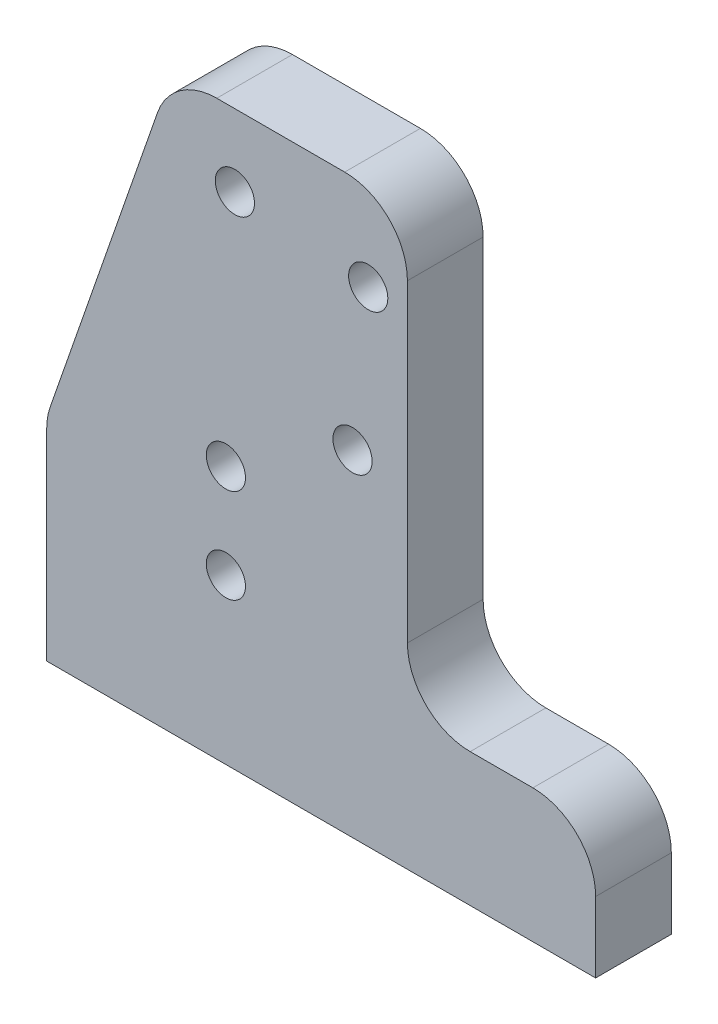
ISO-10303-21;
HEADER;
FILE_DESCRIPTION(('STEP AP214'),'2;1');
FILE_NAME('part.step','',(''),(''),'','','');
FILE_SCHEMA(('AUTOMOTIVE_DESIGN { 1 0 10303 214 1 1 1 1 }'));
ENDSEC;
DATA;
#1=APPLICATION_CONTEXT('core data for automotive mechanical design processes');
#2=APPLICATION_PROTOCOL_DEFINITION('international standard','automotive_design',2000,#1);
#3=PRODUCT_CONTEXT('',#1,'mechanical');
#4=PRODUCT('Part','Part','',(#3));
#5=PRODUCT_RELATED_PRODUCT_CATEGORY('part','',(#4));
#6=PRODUCT_DEFINITION_FORMATION('','',#4);
#7=PRODUCT_DEFINITION_CONTEXT('part definition',#1,'design');
#8=PRODUCT_DEFINITION('design','',#6,#7);
#9=PRODUCT_DEFINITION_SHAPE('','',#8);
#10=(LENGTH_UNIT() NAMED_UNIT(*) SI_UNIT(.MILLI.,.METRE.));
#11=(NAMED_UNIT(*) PLANE_ANGLE_UNIT() SI_UNIT($,.RADIAN.));
#12=(NAMED_UNIT(*) SI_UNIT($,.STERADIAN.) SOLID_ANGLE_UNIT());
#13=UNCERTAINTY_MEASURE_WITH_UNIT(LENGTH_MEASURE(1.E-05),#10,'distance_accuracy_value','');
#14=(GEOMETRIC_REPRESENTATION_CONTEXT(3) GLOBAL_UNCERTAINTY_ASSIGNED_CONTEXT((#13)) GLOBAL_UNIT_ASSIGNED_CONTEXT((#10,
#11,#12)) REPRESENTATION_CONTEXT('',''));
#15=CARTESIAN_POINT('',(0.,0.,0.));
#16=DIRECTION('',(0.,0.,1.));
#17=DIRECTION('',(1.,0.,0.));
#18=AXIS2_PLACEMENT_3D('',#15,#16,#17);
#19=CARTESIAN_POINT('',(0.,36.5,4.826));
#20=DIRECTION('',(0.,1.,0.));
#21=DIRECTION('',(0.,0.,1.));
#22=AXIS2_PLACEMENT_3D('',#19,#20,#21);
#23=PLANE('',#22);
#24=DIRECTION('',(1.,0.,0.));
#25=VECTOR('',#24,1.);
#26=CARTESIAN_POINT('',(0.,36.5,0.));
#27=LINE('',#26,#25);
#28=CARTESIAN_POINT('',(10.8437550128299,36.5,0.));
#29=VERTEX_POINT('',#28);
#30=CARTESIAN_POINT('',(19.,36.5,0.));
#31=VERTEX_POINT('',#30);
#32=EDGE_CURVE('E190',#29,#31,#27,.T.);
#33=ORIENTED_EDGE('',*,*,#32,.F.);
#34=DIRECTION('',(0.,0.,-1.));
#35=VECTOR('',#34,1.);
#36=CARTESIAN_POINT('',(10.8437550128299,36.5,4.826));
#37=LINE('',#36,#35);
#38=CARTESIAN_POINT('',(10.8437550128299,36.5,4.826));
#39=VERTEX_POINT('',#38);
#40=EDGE_CURVE('E289',#29,#39,#37,.F.);
#41=ORIENTED_EDGE('',*,*,#40,.T.);
#42=DIRECTION('',(1.,0.,0.));
#43=VECTOR('',#42,1.);
#44=CARTESIAN_POINT('',(0.,36.5,4.826));
#45=LINE('',#44,#43);
#46=CARTESIAN_POINT('',(19.,36.5,4.826));
#47=VERTEX_POINT('',#46);
#48=EDGE_CURVE('E191',#39,#47,#45,.T.);
#49=ORIENTED_EDGE('',*,*,#48,.T.);
#50=DIRECTION('',(0.,0.,-1.));
#51=VECTOR('',#50,1.);
#52=CARTESIAN_POINT('',(19.,36.5,4.826));
#53=LINE('',#52,#51);
#54=EDGE_CURVE('E285',#47,#31,#53,.T.);
#55=ORIENTED_EDGE('',*,*,#54,.T.);
#56=EDGE_LOOP('',(#33,#41,#49,#55));
#57=FACE_BOUND('',#56,.T.);
#58=ADVANCED_FACE('F60',(#57),#23,.T.);
#59=CARTESIAN_POINT('',(-4.18887015177066,1.45699831365936,4.826));
#60=DIRECTION('',(0.944496796706159,-0.328520624941273,0.));
#61=DIRECTION('',(0.328520624941273,0.944496796706159,0.));
#62=AXIS2_PLACEMENT_3D('',#59,#60,#61);
#63=PLANE('',#62);
#64=DIRECTION('',(-0.328520624941273,-0.944496796706159,0.));
#65=VECTOR('',#64,1.);
#66=CARTESIAN_POINT('',(-4.18887015177066,1.45699831365936,0.));
#67=LINE('',#66,#65);
#68=CARTESIAN_POINT('',(7.06576782600525,33.8140824997651,0.));
#69=VERTEX_POINT('',#68);
#70=CARTESIAN_POINT('',(0.222012813175365,14.1382868378792,0.));
#71=VERTEX_POINT('',#70);
#72=EDGE_CURVE('E222',#69,#71,#67,.T.);
#73=ORIENTED_EDGE('',*,*,#72,.T.);
#74=DIRECTION('',(0.,0.,-1.));
#75=VECTOR('',#74,1.);
#76=CARTESIAN_POINT('',(0.222012813175365,14.1382868378792,4.826));
#77=LINE('',#76,#75);
#78=CARTESIAN_POINT('',(0.222012813175365,14.1382868378792,4.826));
#79=VERTEX_POINT('',#78);
#80=EDGE_CURVE('E270',#71,#79,#77,.F.);
#81=ORIENTED_EDGE('',*,*,#80,.T.);
#82=DIRECTION('',(-0.328520624941273,-0.944496796706159,0.));
#83=VECTOR('',#82,1.);
#84=CARTESIAN_POINT('',(-4.18887015177066,1.45699831365936,4.826));
#85=LINE('',#84,#83);
#86=CARTESIAN_POINT('',(7.06576782600525,33.8140824997651,4.826));
#87=VERTEX_POINT('',#86);
#88=EDGE_CURVE('E195',#87,#79,#85,.T.);
#89=ORIENTED_EDGE('',*,*,#88,.F.);
#90=DIRECTION('',(0.,0.,-1.));
#91=VECTOR('',#90,1.);
#92=CARTESIAN_POINT('',(7.06576782600525,33.8140824997651,0.));
#93=LINE('',#92,#91);
#94=EDGE_CURVE('E266',#87,#69,#93,.T.);
#95=ORIENTED_EDGE('',*,*,#94,.T.);
#96=EDGE_LOOP('',(#73,#81,#89,#95));
#97=FACE_BOUND('',#96,.T.);
#98=ADVANCED_FACE('F335',(#97),#63,.F.);
#99=CARTESIAN_POINT('',(0.,0.,4.826));
#100=DIRECTION('',(-1.,0.,0.));
#101=DIRECTION('',(0.,0.,1.));
#102=AXIS2_PLACEMENT_3D('',#99,#100,#101);
#103=PLANE('',#102);
#104=DIRECTION('',(0.,1.,0.));
#105=VECTOR('',#104,1.);
#106=CARTESIAN_POINT('',(0.,0.,4.826));
#107=LINE('',#106,#105);
#108=CARTESIAN_POINT('',(0.,0.,4.826));
#109=VERTEX_POINT('',#108);
#110=CARTESIAN_POINT('',(0.,12.8242043381141,4.826));
#111=VERTEX_POINT('',#110);
#112=EDGE_CURVE('E200',#109,#111,#107,.T.);
#113=ORIENTED_EDGE('',*,*,#112,.T.);
#114=DIRECTION('',(0.,0.,-1.));
#115=VECTOR('',#114,1.);
#116=CARTESIAN_POINT('',(0.,12.8242043381141,0.));
#117=LINE('',#116,#115);
#118=CARTESIAN_POINT('',(0.,12.8242043381141,0.));
#119=VERTEX_POINT('',#118);
#120=EDGE_CURVE('E250',#111,#119,#117,.T.);
#121=ORIENTED_EDGE('',*,*,#120,.T.);
#122=DIRECTION('',(0.,1.,0.));
#123=VECTOR('',#122,1.);
#124=CARTESIAN_POINT('',(0.,0.,0.));
#125=LINE('',#124,#123);
#126=CARTESIAN_POINT('',(0.,0.,0.));
#127=VERTEX_POINT('',#126);
#128=EDGE_CURVE('E226',#127,#119,#125,.T.);
#129=ORIENTED_EDGE('',*,*,#128,.F.);
#130=DIRECTION('',(0.,0.,-1.));
#131=VECTOR('',#130,1.);
#132=CARTESIAN_POINT('',(0.,0.,4.826));
#133=LINE('',#132,#131);
#134=EDGE_CURVE('E247',#109,#127,#133,.T.);
#135=ORIENTED_EDGE('',*,*,#134,.F.);
#136=EDGE_LOOP('',(#113,#121,#129,#135));
#137=FACE_BOUND('',#136,.T.);
#138=ADVANCED_FACE('F344',(#137),#103,.T.);
#139=CARTESIAN_POINT('',(0.,0.,4.826));
#140=DIRECTION('',(0.,-1.,0.));
#141=DIRECTION('',(1.,0.,0.));
#142=AXIS2_PLACEMENT_3D('',#139,#140,#141);
#143=PLANE('',#142);
#144=CARTESIAN_POINT('',(16.73,0.,2.413));
#145=DIRECTION('',(0.,-1.,0.));
#146=DIRECTION('',(0.,0.,-1.));
#147=AXIS2_PLACEMENT_3D('',#144,#145,#146);
#148=CIRCLE('',#147,1.24999999999999);
#149=CARTESIAN_POINT('',(16.73,0.,1.16300000000001));
#150=VERTEX_POINT('',#149);
#151=EDGE_CURVE('E166',#150,#150,#148,.T.);
#152=ORIENTED_EDGE('',*,*,#151,.F.);
#153=EDGE_LOOP('',(#152));
#154=FACE_BOUND('',#153,.T.);
#155=CARTESIAN_POINT('',(28.73,0.,2.413));
#156=DIRECTION('',(0.,-1.,0.));
#157=DIRECTION('',(0.,0.,-1.));
#158=AXIS2_PLACEMENT_3D('',#155,#156,#157);
#159=CIRCLE('',#158,1.24999999999999);
#160=CARTESIAN_POINT('',(28.73,0.,1.16300000000001));
#161=VERTEX_POINT('',#160);
#162=EDGE_CURVE('E165',#161,#161,#159,.T.);
#163=ORIENTED_EDGE('',*,*,#162,.F.);
#164=EDGE_LOOP('',(#163));
#165=FACE_BOUND('',#164,.T.);
#166=DIRECTION('',(-1.,0.,0.));
#167=VECTOR('',#166,1.);
#168=CARTESIAN_POINT('',(0.,0.,0.));
#169=LINE('',#168,#167);
#170=CARTESIAN_POINT('',(35.,0.,0.));
#171=VERTEX_POINT('',#170);
#172=EDGE_CURVE('E230',#171,#127,#169,.T.);
#173=ORIENTED_EDGE('',*,*,#172,.F.);
#174=DIRECTION('',(0.,0.,-1.));
#175=VECTOR('',#174,1.);
#176=CARTESIAN_POINT('',(35.,0.,4.826));
#177=LINE('',#176,#175);
#178=CARTESIAN_POINT('',(35.,0.,4.826));
#179=VERTEX_POINT('',#178);
#180=EDGE_CURVE('E218',#179,#171,#177,.T.);
#181=ORIENTED_EDGE('',*,*,#180,.F.);
#182=DIRECTION('',(-1.,0.,0.));
#183=VECTOR('',#182,1.);
#184=CARTESIAN_POINT('',(0.,0.,4.826));
#185=LINE('',#184,#183);
#186=EDGE_CURVE('E204',#179,#109,#185,.T.);
#187=ORIENTED_EDGE('',*,*,#186,.T.);
#188=ORIENTED_EDGE('',*,*,#134,.T.);
#189=EDGE_LOOP('',(#173,#181,#187,#188));
#190=FACE_BOUND('',#189,.T.);
#191=ADVANCED_FACE('F349',(#154,#165,#190),#143,.T.);
#192=CARTESIAN_POINT('',(35.,0.,4.826));
#193=DIRECTION('',(1.,0.,0.));
#194=DIRECTION('',(0.,0.,-1.));
#195=AXIS2_PLACEMENT_3D('',#192,#193,#194);
#196=PLANE('',#195);
#197=DIRECTION('',(0.,-1.,0.));
#198=VECTOR('',#197,1.);
#199=CARTESIAN_POINT('',(35.,0.,0.));
#200=LINE('',#199,#198);
#201=CARTESIAN_POINT('',(35.,4.5,0.));
#202=VERTEX_POINT('',#201);
#203=EDGE_CURVE('E234',#202,#171,#200,.T.);
#204=ORIENTED_EDGE('',*,*,#203,.F.);
#205=DIRECTION('',(0.,0.,-1.));
#206=VECTOR('',#205,1.);
#207=CARTESIAN_POINT('',(35.,4.5,4.826));
#208=LINE('',#207,#206);
#209=CARTESIAN_POINT('',(35.,4.5,4.826));
#210=VERTEX_POINT('',#209);
#211=EDGE_CURVE('E299',#202,#210,#208,.F.);
#212=ORIENTED_EDGE('',*,*,#211,.T.);
#213=DIRECTION('',(0.,-1.,0.));
#214=VECTOR('',#213,1.);
#215=CARTESIAN_POINT('',(35.,0.,4.826));
#216=LINE('',#215,#214);
#217=EDGE_CURVE('E208',#210,#179,#216,.T.);
#218=ORIENTED_EDGE('',*,*,#217,.T.);
#219=ORIENTED_EDGE('',*,*,#180,.T.);
#220=EDGE_LOOP('',(#204,#212,#218,#219));
#221=FACE_BOUND('',#220,.T.);
#222=ADVANCED_FACE('F357',(#221),#196,.T.);
#223=CARTESIAN_POINT('',(0.,8.5,4.826));
#224=DIRECTION('',(0.,1.,0.));
#225=DIRECTION('',(0.,0.,1.));
#226=AXIS2_PLACEMENT_3D('',#223,#224,#225);
#227=PLANE('',#226);
#228=DIRECTION('',(1.,0.,0.));
#229=VECTOR('',#228,1.);
#230=CARTESIAN_POINT('',(0.,8.5,4.826));
#231=LINE('',#230,#229);
#232=CARTESIAN_POINT('',(27.,8.5,4.826));
#233=VERTEX_POINT('',#232);
#234=CARTESIAN_POINT('',(31.,8.5,4.826));
#235=VERTEX_POINT('',#234);
#236=EDGE_CURVE('E211',#233,#235,#231,.T.);
#237=ORIENTED_EDGE('',*,*,#236,.T.);
#238=DIRECTION('',(0.,0.,-1.));
#239=VECTOR('',#238,1.);
#240=CARTESIAN_POINT('',(31.,8.5,4.826));
#241=LINE('',#240,#239);
#242=CARTESIAN_POINT('',(31.,8.5,0.));
#243=VERTEX_POINT('',#242);
#244=EDGE_CURVE('E295',#235,#243,#241,.T.);
#245=ORIENTED_EDGE('',*,*,#244,.T.);
#246=DIRECTION('',(1.,0.,0.));
#247=VECTOR('',#246,1.);
#248=CARTESIAN_POINT('',(0.,8.5,0.));
#249=LINE('',#248,#247);
#250=CARTESIAN_POINT('',(27.,8.5,0.));
#251=VERTEX_POINT('',#250);
#252=EDGE_CURVE('E237',#251,#243,#249,.T.);
#253=ORIENTED_EDGE('',*,*,#252,.F.);
#254=DIRECTION('',(0.,0.,-1.));
#255=VECTOR('',#254,1.);
#256=CARTESIAN_POINT('',(27.,8.5,4.826));
#257=LINE('',#256,#255);
#258=EDGE_CURVE('E292',#251,#233,#257,.F.);
#259=ORIENTED_EDGE('',*,*,#258,.T.);
#260=EDGE_LOOP('',(#237,#245,#253,#259));
#261=FACE_BOUND('',#260,.T.);
#262=ADVANCED_FACE('F316',(#261),#227,.T.);
#263=CARTESIAN_POINT('',(23.,0.,4.826));
#264=DIRECTION('',(1.,0.,0.));
#265=DIRECTION('',(0.,1.,0.));
#266=AXIS2_PLACEMENT_3D('',#263,#264,#265);
#267=PLANE('',#266);
#268=DIRECTION('',(0.,-1.,0.));
#269=VECTOR('',#268,1.);
#270=CARTESIAN_POINT('',(23.,0.,4.826));
#271=LINE('',#270,#269);
#272=CARTESIAN_POINT('',(23.,32.5,4.826));
#273=VERTEX_POINT('',#272);
#274=CARTESIAN_POINT('',(23.,12.5,4.826));
#275=VERTEX_POINT('',#274);
#276=EDGE_CURVE('E215',#273,#275,#271,.T.);
#277=ORIENTED_EDGE('',*,*,#276,.T.);
#278=DIRECTION('',(0.,0.,-1.));
#279=VECTOR('',#278,1.);
#280=CARTESIAN_POINT('',(23.,12.5,0.));
#281=LINE('',#280,#279);
#282=CARTESIAN_POINT('',(23.,12.5,0.));
#283=VERTEX_POINT('',#282);
#284=EDGE_CURVE('E304',#275,#283,#281,.T.);
#285=ORIENTED_EDGE('',*,*,#284,.T.);
#286=DIRECTION('',(0.,-1.,0.));
#287=VECTOR('',#286,1.);
#288=CARTESIAN_POINT('',(23.,0.,0.));
#289=LINE('',#288,#287);
#290=CARTESIAN_POINT('',(23.,32.5,0.));
#291=VERTEX_POINT('',#290);
#292=EDGE_CURVE('E196',#291,#283,#289,.T.);
#293=ORIENTED_EDGE('',*,*,#292,.F.);
#294=DIRECTION('',(0.,0.,-1.));
#295=VECTOR('',#294,1.);
#296=CARTESIAN_POINT('',(23.,32.5,4.826));
#297=LINE('',#296,#295);
#298=EDGE_CURVE('E81',#291,#273,#297,.F.);
#299=ORIENTED_EDGE('',*,*,#298,.T.);
#300=EDGE_LOOP('',(#277,#285,#293,#299));
#301=FACE_BOUND('',#300,.T.);
#302=ADVANCED_FACE('F319',(#301),#267,.T.);
#303=CARTESIAN_POINT('',(0.,0.,4.826));
#304=DIRECTION('',(0.,0.,1.));
#305=DIRECTION('',(1.,0.,0.));
#306=AXIS2_PLACEMENT_3D('',#303,#304,#305);
#307=PLANE('',#306);
#308=CARTESIAN_POINT('',(11.425,16.46,4.826));
#309=DIRECTION('',(0.,0.,1.));
#310=DIRECTION('',(1.,0.,0.));
#311=AXIS2_PLACEMENT_3D('',#308,#309,#310);
#312=CIRCLE('',#311,1.24999999999999);
#313=CARTESIAN_POINT('',(12.675,16.46,4.826));
#314=VERTEX_POINT('',#313);
#315=EDGE_CURVE('E548',#314,#314,#312,.T.);
#316=ORIENTED_EDGE('',*,*,#315,.F.);
#317=EDGE_LOOP('',(#316));
#318=FACE_BOUND('',#317,.T.);
#319=CARTESIAN_POINT('',(11.425,10.46,4.826));
#320=DIRECTION('',(0.,0.,1.));
#321=DIRECTION('',(1.,0.,0.));
#322=AXIS2_PLACEMENT_3D('',#319,#320,#321);
#323=CIRCLE('',#322,1.24999999999999);
#324=CARTESIAN_POINT('',(12.675,10.46,4.826));
#325=VERTEX_POINT('',#324);
#326=EDGE_CURVE('E537',#325,#325,#323,.T.);
#327=ORIENTED_EDGE('',*,*,#326,.F.);
#328=EDGE_LOOP('',(#327));
#329=FACE_BOUND('',#328,.T.);
#330=CARTESIAN_POINT('',(19.5,21.4,4.826));
#331=DIRECTION('',(0.,0.,1.));
#332=DIRECTION('',(1.,0.,0.));
#333=AXIS2_PLACEMENT_3D('',#330,#331,#332);
#334=CIRCLE('',#333,1.25);
#335=CARTESIAN_POINT('',(20.75,21.4,4.826));
#336=VERTEX_POINT('',#335);
#337=EDGE_CURVE('E545',#336,#336,#334,.T.);
#338=ORIENTED_EDGE('',*,*,#337,.F.);
#339=EDGE_LOOP('',(#338));
#340=FACE_BOUND('',#339,.T.);
#341=CARTESIAN_POINT('',(20.5,30.9,4.826));
#342=DIRECTION('',(0.,0.,1.));
#343=DIRECTION('',(1.,0.,0.));
#344=AXIS2_PLACEMENT_3D('',#341,#342,#343);
#345=CIRCLE('',#344,1.25);
#346=CARTESIAN_POINT('',(21.75,30.9,4.826));
#347=VERTEX_POINT('',#346);
#348=EDGE_CURVE('E559',#347,#347,#345,.T.);
#349=ORIENTED_EDGE('',*,*,#348,.F.);
#350=EDGE_LOOP('',(#349));
#351=FACE_BOUND('',#350,.T.);
#352=CARTESIAN_POINT('',(12.,31.9,4.826));
#353=DIRECTION('',(0.,0.,1.));
#354=DIRECTION('',(1.,0.,0.));
#355=AXIS2_PLACEMENT_3D('',#352,#353,#354);
#356=CIRCLE('',#355,1.25);
#357=CARTESIAN_POINT('',(13.25,31.9,4.826));
#358=VERTEX_POINT('',#357);
#359=EDGE_CURVE('E182',#358,#358,#356,.T.);
#360=ORIENTED_EDGE('',*,*,#359,.F.);
#361=EDGE_LOOP('',(#360));
#362=FACE_BOUND('',#361,.T.);
#363=ORIENTED_EDGE('',*,*,#88,.T.);
#364=CARTESIAN_POINT('',(4.,12.8242043381141,4.826));
#365=DIRECTION('',(0.,0.,1.));
#366=DIRECTION('',(1.,0.,0.));
#367=AXIS2_PLACEMENT_3D('',#364,#365,#366);
#368=CIRCLE('',#367,4.);
#369=EDGE_CURVE('E282',#79,#111,#368,.T.);
#370=ORIENTED_EDGE('',*,*,#369,.T.);
#371=ORIENTED_EDGE('',*,*,#112,.F.);
#372=ORIENTED_EDGE('',*,*,#186,.F.);
#373=ORIENTED_EDGE('',*,*,#217,.F.);
#374=CARTESIAN_POINT('',(31.,4.5,4.826));
#375=DIRECTION('',(0.,0.,1.));
#376=DIRECTION('',(1.,0.,0.));
#377=AXIS2_PLACEMENT_3D('',#374,#375,#376);
#378=CIRCLE('',#377,4.);
#379=EDGE_CURVE('E276',#210,#235,#378,.T.);
#380=ORIENTED_EDGE('',*,*,#379,.T.);
#381=ORIENTED_EDGE('',*,*,#236,.F.);
#382=CARTESIAN_POINT('',(27.,12.5,4.826));
#383=DIRECTION('',(0.,0.,1.));
#384=DIRECTION('',(1.,0.,0.));
#385=AXIS2_PLACEMENT_3D('',#382,#383,#384);
#386=CIRCLE('',#385,4.);
#387=EDGE_CURVE('E13',#233,#275,#386,.F.);
#388=ORIENTED_EDGE('',*,*,#387,.T.);
#389=ORIENTED_EDGE('',*,*,#276,.F.);
#390=CARTESIAN_POINT('',(19.,32.5,4.826));
#391=DIRECTION('',(0.,0.,1.));
#392=DIRECTION('',(1.,0.,0.));
#393=AXIS2_PLACEMENT_3D('',#390,#391,#392);
#394=CIRCLE('',#393,4.);
#395=EDGE_CURVE('E273',#273,#47,#394,.T.);
#396=ORIENTED_EDGE('',*,*,#395,.T.);
#397=ORIENTED_EDGE('',*,*,#48,.F.);
#398=CARTESIAN_POINT('',(10.8437550128299,32.5,4.826));
#399=DIRECTION('',(0.,0.,1.));
#400=DIRECTION('',(1.,0.,0.));
#401=AXIS2_PLACEMENT_3D('',#398,#399,#400);
#402=CIRCLE('',#401,4.);
#403=EDGE_CURVE('E279',#39,#87,#402,.T.);
#404=ORIENTED_EDGE('',*,*,#403,.T.);
#405=EDGE_LOOP('',(#363,#370,#371,#372,#373,#380,#381,#388,#389,#396,#397,#404));
#406=FACE_BOUND('',#405,.T.);
#407=ADVANCED_FACE('F321',(#318,#329,#340,#351,#362,#406),#307,.T.);
#408=CARTESIAN_POINT('',(0.,0.,0.));
#409=DIRECTION('',(0.,0.,1.));
#410=DIRECTION('',(1.,0.,0.));
#411=AXIS2_PLACEMENT_3D('',#408,#409,#410);
#412=PLANE('',#411);
#413=CARTESIAN_POINT('',(11.425,16.46,0.));
#414=DIRECTION('',(0.,0.,1.));
#415=DIRECTION('',(1.,0.,0.));
#416=AXIS2_PLACEMENT_3D('',#413,#414,#415);
#417=CIRCLE('',#416,1.24999999999999);
#418=CARTESIAN_POINT('',(12.675,16.46,0.));
#419=VERTEX_POINT('',#418);
#420=EDGE_CURVE('E540',#419,#419,#417,.T.);
#421=ORIENTED_EDGE('',*,*,#420,.T.);
#422=EDGE_LOOP('',(#421));
#423=FACE_BOUND('',#422,.T.);
#424=CARTESIAN_POINT('',(11.425,10.46,0.));
#425=DIRECTION('',(0.,0.,1.));
#426=DIRECTION('',(1.,0.,0.));
#427=AXIS2_PLACEMENT_3D('',#424,#425,#426);
#428=CIRCLE('',#427,1.24999999999999);
#429=CARTESIAN_POINT('',(12.675,10.46,0.));
#430=VERTEX_POINT('',#429);
#431=EDGE_CURVE('E534',#430,#430,#428,.T.);
#432=ORIENTED_EDGE('',*,*,#431,.T.);
#433=EDGE_LOOP('',(#432));
#434=FACE_BOUND('',#433,.T.);
#435=CARTESIAN_POINT('',(19.5,21.4,0.));
#436=DIRECTION('',(0.,0.,1.));
#437=DIRECTION('',(1.,0.,0.));
#438=AXIS2_PLACEMENT_3D('',#435,#436,#437);
#439=CIRCLE('',#438,1.25);
#440=CARTESIAN_POINT('',(20.75,21.4,0.));
#441=VERTEX_POINT('',#440);
#442=EDGE_CURVE('E555',#441,#441,#439,.T.);
#443=ORIENTED_EDGE('',*,*,#442,.T.);
#444=EDGE_LOOP('',(#443));
#445=FACE_BOUND('',#444,.T.);
#446=CARTESIAN_POINT('',(20.5,30.9,0.));
#447=DIRECTION('',(0.,0.,1.));
#448=DIRECTION('',(1.,0.,0.));
#449=AXIS2_PLACEMENT_3D('',#446,#447,#448);
#450=CIRCLE('',#449,1.25);
#451=CARTESIAN_POINT('',(21.75,30.9,0.));
#452=VERTEX_POINT('',#451);
#453=EDGE_CURVE('E175',#452,#452,#450,.T.);
#454=ORIENTED_EDGE('',*,*,#453,.T.);
#455=EDGE_LOOP('',(#454));
#456=FACE_BOUND('',#455,.T.);
#457=CARTESIAN_POINT('',(12.,31.9,0.));
#458=DIRECTION('',(0.,0.,1.));
#459=DIRECTION('',(1.,0.,0.));
#460=AXIS2_PLACEMENT_3D('',#457,#458,#459);
#461=CIRCLE('',#460,1.25);
#462=CARTESIAN_POINT('',(13.25,31.9,0.));
#463=VERTEX_POINT('',#462);
#464=EDGE_CURVE('E186',#463,#463,#461,.T.);
#465=ORIENTED_EDGE('',*,*,#464,.T.);
#466=EDGE_LOOP('',(#465));
#467=FACE_BOUND('',#466,.T.);
#468=ORIENTED_EDGE('',*,*,#128,.T.);
#469=CARTESIAN_POINT('',(4.,12.8242043381141,0.));
#470=DIRECTION('',(0.,0.,1.));
#471=DIRECTION('',(1.,0.,0.));
#472=AXIS2_PLACEMENT_3D('',#469,#470,#471);
#473=CIRCLE('',#472,4.);
#474=EDGE_CURVE('E263',#119,#71,#473,.F.);
#475=ORIENTED_EDGE('',*,*,#474,.T.);
#476=ORIENTED_EDGE('',*,*,#72,.F.);
#477=CARTESIAN_POINT('',(10.8437550128299,32.5,0.));
#478=DIRECTION('',(0.,0.,1.));
#479=DIRECTION('',(1.,0.,0.));
#480=AXIS2_PLACEMENT_3D('',#477,#478,#479);
#481=CIRCLE('',#480,4.);
#482=EDGE_CURVE('E260',#69,#29,#481,.F.);
#483=ORIENTED_EDGE('',*,*,#482,.T.);
#484=ORIENTED_EDGE('',*,*,#32,.T.);
#485=CARTESIAN_POINT('',(19.,32.5,0.));
#486=DIRECTION('',(0.,0.,1.));
#487=DIRECTION('',(1.,0.,0.));
#488=AXIS2_PLACEMENT_3D('',#485,#486,#487);
#489=CIRCLE('',#488,4.);
#490=EDGE_CURVE('E254',#31,#291,#489,.F.);
#491=ORIENTED_EDGE('',*,*,#490,.T.);
#492=ORIENTED_EDGE('',*,*,#292,.T.);
#493=CARTESIAN_POINT('',(27.,12.5,0.));
#494=DIRECTION('',(0.,0.,1.));
#495=DIRECTION('',(1.,0.,0.));
#496=AXIS2_PLACEMENT_3D('',#493,#494,#495);
#497=CIRCLE('',#496,4.);
#498=EDGE_CURVE('E69',#283,#251,#497,.T.);
#499=ORIENTED_EDGE('',*,*,#498,.T.);
#500=ORIENTED_EDGE('',*,*,#252,.T.);
#501=CARTESIAN_POINT('',(31.,4.5,0.));
#502=DIRECTION('',(0.,0.,1.));
#503=DIRECTION('',(1.,0.,0.));
#504=AXIS2_PLACEMENT_3D('',#501,#502,#503);
#505=CIRCLE('',#504,4.);
#506=EDGE_CURVE('E257',#243,#202,#505,.F.);
#507=ORIENTED_EDGE('',*,*,#506,.T.);
#508=ORIENTED_EDGE('',*,*,#203,.T.);
#509=ORIENTED_EDGE('',*,*,#172,.T.);
#510=EDGE_LOOP('',(#468,#475,#476,#483,#484,#491,#492,#499,#500,#507,#508,#509));
#511=FACE_BOUND('',#510,.T.);
#512=ADVANCED_FACE('F311',(#423,#434,#445,#456,#467,#511),#412,.F.);
#513=CARTESIAN_POINT('',(12.,31.9,4.826));
#514=DIRECTION('',(0.,0.,1.));
#515=DIRECTION('',(1.,0.,0.));
#516=AXIS2_PLACEMENT_3D('',#513,#514,#515);
#517=CYLINDRICAL_SURFACE('',#516,1.25);
#518=ORIENTED_EDGE('',*,*,#464,.F.);
#519=EDGE_LOOP('',(#518));
#520=FACE_BOUND('',#519,.T.);
#521=ORIENTED_EDGE('',*,*,#359,.T.);
#522=EDGE_LOOP('',(#521));
#523=FACE_BOUND('',#522,.T.);
#524=ADVANCED_FACE('F409',(#520,#523),#517,.F.);
#525=CARTESIAN_POINT('',(28.73,5.,2.413));
#526=DIRECTION('',(0.,-1.,0.));
#527=DIRECTION('',(0.,0.,-1.));
#528=AXIS2_PLACEMENT_3D('',#525,#526,#527);
#529=CONICAL_SURFACE('',#528,1.25,1.02974425867665);
#530=CARTESIAN_POINT('',(28.73,5.75107577378445,2.413));
#531=VERTEX_POINT('',#530);
#532=VERTEX_LOOP('',#531);
#533=FACE_BOUND('',#532,.T.);
#534=CARTESIAN_POINT('',(28.73,5.,2.413));
#535=DIRECTION('',(0.,-1.,0.));
#536=DIRECTION('',(0.,0.,-1.));
#537=AXIS2_PLACEMENT_3D('',#534,#535,#536);
#538=CIRCLE('',#537,1.25);
#539=CARTESIAN_POINT('',(28.73,5.,1.163));
#540=VERTEX_POINT('',#539);
#541=EDGE_CURVE('E172',#540,#540,#538,.T.);
#542=ORIENTED_EDGE('',*,*,#541,.T.);
#543=EDGE_LOOP('',(#542));
#544=FACE_BOUND('',#543,.T.);
#545=ADVANCED_FACE('F405',(#533,#544),#529,.F.);
#546=CARTESIAN_POINT('',(28.73,0.,2.413));
#547=DIRECTION('',(0.,-1.,0.));
#548=DIRECTION('',(0.,0.,-1.));
#549=AXIS2_PLACEMENT_3D('',#546,#547,#548);
#550=CYLINDRICAL_SURFACE('',#549,1.24999999999999);
#551=ORIENTED_EDGE('',*,*,#541,.F.);
#552=EDGE_LOOP('',(#551));
#553=FACE_BOUND('',#552,.T.);
#554=ORIENTED_EDGE('',*,*,#162,.T.);
#555=EDGE_LOOP('',(#554));
#556=FACE_BOUND('',#555,.T.);
#557=ADVANCED_FACE('F158',(#553,#556),#550,.F.);
#558=CARTESIAN_POINT('',(16.73,5.,2.413));
#559=DIRECTION('',(0.,-1.,0.));
#560=DIRECTION('',(0.,0.,-1.));
#561=AXIS2_PLACEMENT_3D('',#558,#559,#560);
#562=CONICAL_SURFACE('',#561,1.25,1.02974425867665);
#563=CARTESIAN_POINT('',(16.73,5.75107577378445,2.413));
#564=VERTEX_POINT('',#563);
#565=VERTEX_LOOP('',#564);
#566=FACE_BOUND('',#565,.T.);
#567=CARTESIAN_POINT('',(16.73,5.,2.413));
#568=DIRECTION('',(0.,-1.,0.));
#569=DIRECTION('',(0.,0.,-1.));
#570=AXIS2_PLACEMENT_3D('',#567,#568,#569);
#571=CIRCLE('',#570,1.25);
#572=CARTESIAN_POINT('',(16.73,5.,1.163));
#573=VERTEX_POINT('',#572);
#574=EDGE_CURVE('E162',#573,#573,#571,.T.);
#575=ORIENTED_EDGE('',*,*,#574,.T.);
#576=EDGE_LOOP('',(#575));
#577=FACE_BOUND('',#576,.T.);
#578=ADVANCED_FACE('F154',(#566,#577),#562,.F.);
#579=CARTESIAN_POINT('',(16.73,0.,2.413));
#580=DIRECTION('',(0.,-1.,0.));
#581=DIRECTION('',(0.,0.,-1.));
#582=AXIS2_PLACEMENT_3D('',#579,#580,#581);
#583=CYLINDRICAL_SURFACE('',#582,1.24999999999999);
#584=ORIENTED_EDGE('',*,*,#574,.F.);
#585=EDGE_LOOP('',(#584));
#586=FACE_BOUND('',#585,.T.);
#587=ORIENTED_EDGE('',*,*,#151,.T.);
#588=EDGE_LOOP('',(#587));
#589=FACE_BOUND('',#588,.T.);
#590=ADVANCED_FACE('F157',(#586,#589),#583,.F.);
#591=CARTESIAN_POINT('',(4.,12.8242043381141,4.826));
#592=DIRECTION('',(0.,0.,1.));
#593=DIRECTION('',(1.,0.,0.));
#594=AXIS2_PLACEMENT_3D('',#591,#592,#593);
#595=CYLINDRICAL_SURFACE('',#594,4.);
#596=ORIENTED_EDGE('',*,*,#369,.F.);
#597=ORIENTED_EDGE('',*,*,#80,.F.);
#598=ORIENTED_EDGE('',*,*,#474,.F.);
#599=ORIENTED_EDGE('',*,*,#120,.F.);
#600=EDGE_LOOP('',(#596,#597,#598,#599));
#601=FACE_BOUND('',#600,.T.);
#602=ADVANCED_FACE('F341',(#601),#595,.T.);
#603=CARTESIAN_POINT('',(10.8437550128299,32.5,4.826));
#604=DIRECTION('',(0.,0.,1.));
#605=DIRECTION('',(1.,0.,0.));
#606=AXIS2_PLACEMENT_3D('',#603,#604,#605);
#607=CYLINDRICAL_SURFACE('',#606,4.);
#608=ORIENTED_EDGE('',*,*,#403,.F.);
#609=ORIENTED_EDGE('',*,*,#40,.F.);
#610=ORIENTED_EDGE('',*,*,#482,.F.);
#611=ORIENTED_EDGE('',*,*,#94,.F.);
#612=EDGE_LOOP('',(#608,#609,#610,#611));
#613=FACE_BOUND('',#612,.T.);
#614=ADVANCED_FACE('F332',(#613),#607,.T.);
#615=CARTESIAN_POINT('',(31.,4.5,4.826));
#616=DIRECTION('',(0.,0.,-1.));
#617=DIRECTION('',(-1.,0.,0.));
#618=AXIS2_PLACEMENT_3D('',#615,#616,#617);
#619=CYLINDRICAL_SURFACE('',#618,4.);
#620=ORIENTED_EDGE('',*,*,#379,.F.);
#621=ORIENTED_EDGE('',*,*,#211,.F.);
#622=ORIENTED_EDGE('',*,*,#506,.F.);
#623=ORIENTED_EDGE('',*,*,#244,.F.);
#624=EDGE_LOOP('',(#620,#621,#622,#623));
#625=FACE_BOUND('',#624,.T.);
#626=ADVANCED_FACE('F356',(#625),#619,.T.);
#627=CARTESIAN_POINT('',(27.,12.5,4.826));
#628=DIRECTION('',(0.,0.,1.));
#629=DIRECTION('',(1.,0.,0.));
#630=AXIS2_PLACEMENT_3D('',#627,#628,#629);
#631=CYLINDRICAL_SURFACE('',#630,4.);
#632=ORIENTED_EDGE('',*,*,#387,.F.);
#633=ORIENTED_EDGE('',*,*,#258,.F.);
#634=ORIENTED_EDGE('',*,*,#498,.F.);
#635=ORIENTED_EDGE('',*,*,#284,.F.);
#636=EDGE_LOOP('',(#632,#633,#634,#635));
#637=FACE_BOUND('',#636,.T.);
#638=ADVANCED_FACE('F318',(#637),#631,.F.);
#639=CARTESIAN_POINT('',(19.,32.5,4.826));
#640=DIRECTION('',(0.,0.,-1.));
#641=DIRECTION('',(-1.,0.,0.));
#642=AXIS2_PLACEMENT_3D('',#639,#640,#641);
#643=CYLINDRICAL_SURFACE('',#642,4.);
#644=ORIENTED_EDGE('',*,*,#395,.F.);
#645=ORIENTED_EDGE('',*,*,#298,.F.);
#646=ORIENTED_EDGE('',*,*,#490,.F.);
#647=ORIENTED_EDGE('',*,*,#54,.F.);
#648=EDGE_LOOP('',(#644,#645,#646,#647));
#649=FACE_BOUND('',#648,.T.);
#650=ADVANCED_FACE('F62',(#649),#643,.T.);
#651=CARTESIAN_POINT('',(20.5,30.9,4.826));
#652=DIRECTION('',(0.,0.,1.));
#653=DIRECTION('',(1.,0.,0.));
#654=AXIS2_PLACEMENT_3D('',#651,#652,#653);
#655=CYLINDRICAL_SURFACE('',#654,1.25);
#656=ORIENTED_EDGE('',*,*,#453,.F.);
#657=EDGE_LOOP('',(#656));
#658=FACE_BOUND('',#657,.T.);
#659=ORIENTED_EDGE('',*,*,#348,.T.);
#660=EDGE_LOOP('',(#659));
#661=FACE_BOUND('',#660,.T.);
#662=ADVANCED_FACE('F384',(#658,#661),#655,.F.);
#663=CARTESIAN_POINT('',(19.5,21.4,4.826));
#664=DIRECTION('',(0.,0.,1.));
#665=DIRECTION('',(1.,0.,0.));
#666=AXIS2_PLACEMENT_3D('',#663,#664,#665);
#667=CYLINDRICAL_SURFACE('',#666,1.25);
#668=ORIENTED_EDGE('',*,*,#442,.F.);
#669=EDGE_LOOP('',(#668));
#670=FACE_BOUND('',#669,.T.);
#671=ORIENTED_EDGE('',*,*,#337,.T.);
#672=EDGE_LOOP('',(#671));
#673=FACE_BOUND('',#672,.T.);
#674=ADVANCED_FACE('F388',(#670,#673),#667,.F.);
#675=CARTESIAN_POINT('',(11.425,10.46,4.826));
#676=DIRECTION('',(0.,0.,1.));
#677=DIRECTION('',(1.,0.,0.));
#678=AXIS2_PLACEMENT_3D('',#675,#676,#677);
#679=CYLINDRICAL_SURFACE('',#678,1.24999999999999);
#680=ORIENTED_EDGE('',*,*,#431,.F.);
#681=EDGE_LOOP('',(#680));
#682=FACE_BOUND('',#681,.T.);
#683=ORIENTED_EDGE('',*,*,#326,.T.);
#684=EDGE_LOOP('',(#683));
#685=FACE_BOUND('',#684,.T.);
#686=ADVANCED_FACE('F394',(#682,#685),#679,.F.);
#687=CARTESIAN_POINT('',(11.425,16.46,4.826));
#688=DIRECTION('',(0.,0.,1.));
#689=DIRECTION('',(1.,0.,0.));
#690=AXIS2_PLACEMENT_3D('',#687,#688,#689);
#691=CYLINDRICAL_SURFACE('',#690,1.24999999999999);
#692=ORIENTED_EDGE('',*,*,#420,.F.);
#693=EDGE_LOOP('',(#692));
#694=FACE_BOUND('',#693,.T.);
#695=ORIENTED_EDGE('',*,*,#315,.T.);
#696=EDGE_LOOP('',(#695));
#697=FACE_BOUND('',#696,.T.);
#698=ADVANCED_FACE('F513',(#694,#697),#691,.F.);
#699=CLOSED_SHELL('',(#58,#98,#138,#191,#222,#262,#302,#407,#512,#524,#545,#557,#578,#590,#602,
#614,#626,#638,#650,#662,#674,#686,#698));
#700=MANIFOLD_SOLID_BREP('B2',#699);
#701=ADVANCED_BREP_SHAPE_REPRESENTATION('',(#18,#700),#14);
#702=SHAPE_DEFINITION_REPRESENTATION(#9,#701);
ENDSEC;
END-ISO-10303-21;
